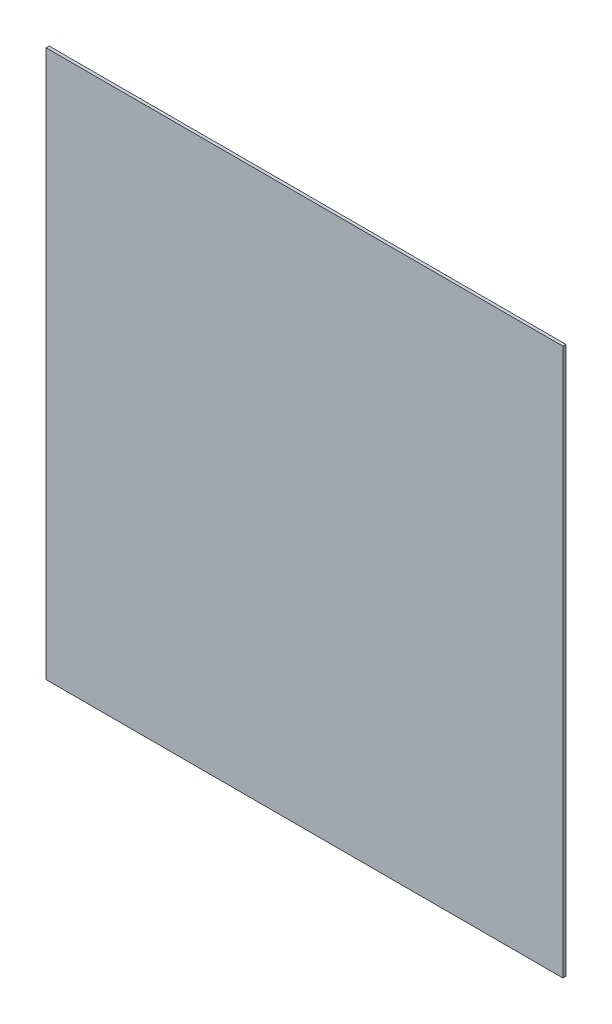
ISO-10303-21;
HEADER;
FILE_DESCRIPTION(('STEP AP214'),'2;1');
FILE_NAME('part.step','',(''),(''),'','','');
FILE_SCHEMA(('AUTOMOTIVE_DESIGN { 1 0 10303 214 1 1 1 1 }'));
ENDSEC;
DATA;
#1=APPLICATION_CONTEXT('core data for automotive mechanical design processes');
#2=APPLICATION_PROTOCOL_DEFINITION('international standard','automotive_design',2000,#1);
#3=PRODUCT_CONTEXT('',#1,'mechanical');
#4=PRODUCT('Part','Part','',(#3));
#5=PRODUCT_RELATED_PRODUCT_CATEGORY('part','',(#4));
#6=PRODUCT_DEFINITION_FORMATION('','',#4);
#7=PRODUCT_DEFINITION_CONTEXT('part definition',#1,'design');
#8=PRODUCT_DEFINITION('design','',#6,#7);
#9=PRODUCT_DEFINITION_SHAPE('','',#8);
#10=(LENGTH_UNIT() NAMED_UNIT(*) SI_UNIT(.MILLI.,.METRE.));
#11=(NAMED_UNIT(*) PLANE_ANGLE_UNIT() SI_UNIT($,.RADIAN.));
#12=(NAMED_UNIT(*) SI_UNIT($,.STERADIAN.) SOLID_ANGLE_UNIT());
#13=UNCERTAINTY_MEASURE_WITH_UNIT(LENGTH_MEASURE(1.E-05),#10,'distance_accuracy_value','');
#14=(GEOMETRIC_REPRESENTATION_CONTEXT(3) GLOBAL_UNCERTAINTY_ASSIGNED_CONTEXT((#13)) GLOBAL_UNIT_ASSIGNED_CONTEXT((#10,
#11,#12)) REPRESENTATION_CONTEXT('',''));
#15=CARTESIAN_POINT('',(0.,0.,0.));
#16=DIRECTION('',(0.,0.,1.));
#17=DIRECTION('',(1.,0.,0.));
#18=AXIS2_PLACEMENT_3D('',#15,#16,#17);
#19=CARTESIAN_POINT('',(-255.,-270.,3.));
#20=DIRECTION('',(1.,0.,0.));
#21=DIRECTION('',(0.,0.,-1.));
#22=AXIS2_PLACEMENT_3D('',#19,#20,#21);
#23=PLANE('',#22);
#24=DIRECTION('',(0.,-1.,0.));
#25=VECTOR('',#24,1.);
#26=CARTESIAN_POINT('',(-255.,-270.,0.));
#27=LINE('',#26,#25);
#28=CARTESIAN_POINT('',(-255.,270.,0.));
#29=VERTEX_POINT('',#28);
#30=CARTESIAN_POINT('',(-255.,-270.,0.));
#31=VERTEX_POINT('',#30);
#32=EDGE_CURVE('E107',#29,#31,#27,.T.);
#33=ORIENTED_EDGE('',*,*,#32,.T.);
#34=DIRECTION('',(0.,0.,-1.));
#35=VECTOR('',#34,1.);
#36=CARTESIAN_POINT('',(-255.,-270.,3.));
#37=LINE('',#36,#35);
#38=CARTESIAN_POINT('',(-255.,-270.,3.));
#39=VERTEX_POINT('',#38);
#40=EDGE_CURVE('E11',#39,#31,#37,.T.);
#41=ORIENTED_EDGE('',*,*,#40,.F.);
#42=DIRECTION('',(0.,-1.,0.));
#43=VECTOR('',#42,1.);
#44=CARTESIAN_POINT('',(-255.,-270.,3.));
#45=LINE('',#44,#43);
#46=CARTESIAN_POINT('',(-255.,270.,3.));
#47=VERTEX_POINT('',#46);
#48=EDGE_CURVE('E91',#47,#39,#45,.T.);
#49=ORIENTED_EDGE('',*,*,#48,.F.);
#50=DIRECTION('',(0.,0.,-1.));
#51=VECTOR('',#50,1.);
#52=CARTESIAN_POINT('',(-255.,270.,3.));
#53=LINE('',#52,#51);
#54=EDGE_CURVE('E103',#47,#29,#53,.T.);
#55=ORIENTED_EDGE('',*,*,#54,.T.);
#56=EDGE_LOOP('',(#33,#41,#49,#55));
#57=FACE_BOUND('',#56,.T.);
#58=ADVANCED_FACE('F39',(#57),#23,.F.);
#59=CARTESIAN_POINT('',(255.,-270.,3.));
#60=DIRECTION('',(0.,1.,0.));
#61=DIRECTION('',(-1.,0.,0.));
#62=AXIS2_PLACEMENT_3D('',#59,#60,#61);
#63=PLANE('',#62);
#64=DIRECTION('',(1.,0.,0.));
#65=VECTOR('',#64,1.);
#66=CARTESIAN_POINT('',(255.,-270.,0.));
#67=LINE('',#66,#65);
#68=CARTESIAN_POINT('',(255.,-270.,0.));
#69=VERTEX_POINT('',#68);
#70=EDGE_CURVE('E96',#31,#69,#67,.T.);
#71=ORIENTED_EDGE('',*,*,#70,.T.);
#72=DIRECTION('',(0.,0.,-1.));
#73=VECTOR('',#72,1.);
#74=CARTESIAN_POINT('',(255.,-270.,3.));
#75=LINE('',#74,#73);
#76=CARTESIAN_POINT('',(255.,-270.,3.));
#77=VERTEX_POINT('',#76);
#78=EDGE_CURVE('E48',#77,#69,#75,.T.);
#79=ORIENTED_EDGE('',*,*,#78,.F.);
#80=DIRECTION('',(1.,0.,0.));
#81=VECTOR('',#80,1.);
#82=CARTESIAN_POINT('',(255.,-270.,3.));
#83=LINE('',#82,#81);
#84=EDGE_CURVE('E86',#39,#77,#83,.T.);
#85=ORIENTED_EDGE('',*,*,#84,.F.);
#86=ORIENTED_EDGE('',*,*,#40,.T.);
#87=EDGE_LOOP('',(#71,#79,#85,#86));
#88=FACE_BOUND('',#87,.T.);
#89=ADVANCED_FACE('F95',(#88),#63,.F.);
#90=CARTESIAN_POINT('',(255.,-270.,3.));
#91=DIRECTION('',(-1.,0.,0.));
#92=DIRECTION('',(0.,0.,1.));
#93=AXIS2_PLACEMENT_3D('',#90,#91,#92);
#94=PLANE('',#93);
#95=DIRECTION('',(0.,1.,0.));
#96=VECTOR('',#95,1.);
#97=CARTESIAN_POINT('',(255.,-270.,0.));
#98=LINE('',#97,#96);
#99=CARTESIAN_POINT('',(255.,270.,0.));
#100=VERTEX_POINT('',#99);
#101=EDGE_CURVE('E73',#69,#100,#98,.T.);
#102=ORIENTED_EDGE('',*,*,#101,.T.);
#103=DIRECTION('',(0.,0.,-1.));
#104=VECTOR('',#103,1.);
#105=CARTESIAN_POINT('',(255.,270.,3.));
#106=LINE('',#105,#104);
#107=CARTESIAN_POINT('',(255.,270.,3.));
#108=VERTEX_POINT('',#107);
#109=EDGE_CURVE('E98',#108,#100,#106,.T.);
#110=ORIENTED_EDGE('',*,*,#109,.F.);
#111=DIRECTION('',(0.,1.,0.));
#112=VECTOR('',#111,1.);
#113=CARTESIAN_POINT('',(255.,-270.,3.));
#114=LINE('',#113,#112);
#115=EDGE_CURVE('E89',#77,#108,#114,.T.);
#116=ORIENTED_EDGE('',*,*,#115,.F.);
#117=ORIENTED_EDGE('',*,*,#78,.T.);
#118=EDGE_LOOP('',(#102,#110,#116,#117));
#119=FACE_BOUND('',#118,.T.);
#120=ADVANCED_FACE('F99',(#119),#94,.F.);
#121=CARTESIAN_POINT('',(255.,270.,3.));
#122=DIRECTION('',(0.,-1.,0.));
#123=DIRECTION('',(1.,0.,0.));
#124=AXIS2_PLACEMENT_3D('',#121,#122,#123);
#125=PLANE('',#124);
#126=DIRECTION('',(-1.,0.,0.));
#127=VECTOR('',#126,1.);
#128=CARTESIAN_POINT('',(255.,270.,0.));
#129=LINE('',#128,#127);
#130=EDGE_CURVE('E79',#100,#29,#129,.T.);
#131=ORIENTED_EDGE('',*,*,#130,.T.);
#132=ORIENTED_EDGE('',*,*,#54,.F.);
#133=DIRECTION('',(-1.,0.,0.));
#134=VECTOR('',#133,1.);
#135=CARTESIAN_POINT('',(255.,270.,3.));
#136=LINE('',#135,#134);
#137=EDGE_CURVE('E56',#108,#47,#136,.T.);
#138=ORIENTED_EDGE('',*,*,#137,.F.);
#139=ORIENTED_EDGE('',*,*,#109,.T.);
#140=EDGE_LOOP('',(#131,#132,#138,#139));
#141=FACE_BOUND('',#140,.T.);
#142=ADVANCED_FACE('F120',(#141),#125,.F.);
#143=CARTESIAN_POINT('',(0.,0.,3.));
#144=DIRECTION('',(0.,0.,1.));
#145=DIRECTION('',(1.,0.,0.));
#146=AXIS2_PLACEMENT_3D('',#143,#144,#145);
#147=PLANE('',#146);
#148=ORIENTED_EDGE('',*,*,#48,.T.);
#149=ORIENTED_EDGE('',*,*,#84,.T.);
#150=ORIENTED_EDGE('',*,*,#115,.T.);
#151=ORIENTED_EDGE('',*,*,#137,.T.);
#152=EDGE_LOOP('',(#148,#149,#150,#151));
#153=FACE_BOUND('',#152,.T.);
#154=ADVANCED_FACE('F87',(#153),#147,.T.);
#155=CARTESIAN_POINT('',(0.,0.,0.));
#156=DIRECTION('',(0.,0.,1.));
#157=DIRECTION('',(1.,0.,0.));
#158=AXIS2_PLACEMENT_3D('',#155,#156,#157);
#159=PLANE('',#158);
#160=ORIENTED_EDGE('',*,*,#32,.F.);
#161=ORIENTED_EDGE('',*,*,#130,.F.);
#162=ORIENTED_EDGE('',*,*,#101,.F.);
#163=ORIENTED_EDGE('',*,*,#70,.F.);
#164=EDGE_LOOP('',(#160,#161,#162,#163));
#165=FACE_BOUND('',#164,.T.);
#166=ADVANCED_FACE('F123',(#165),#159,.F.);
#167=CLOSED_SHELL('',(#58,#89,#120,#142,#154,#166));
#168=MANIFOLD_SOLID_BREP('B2',#167);
#169=ADVANCED_BREP_SHAPE_REPRESENTATION('',(#18,#168),#14);
#170=SHAPE_DEFINITION_REPRESENTATION(#9,#169);
ENDSEC;
END-ISO-10303-21;
